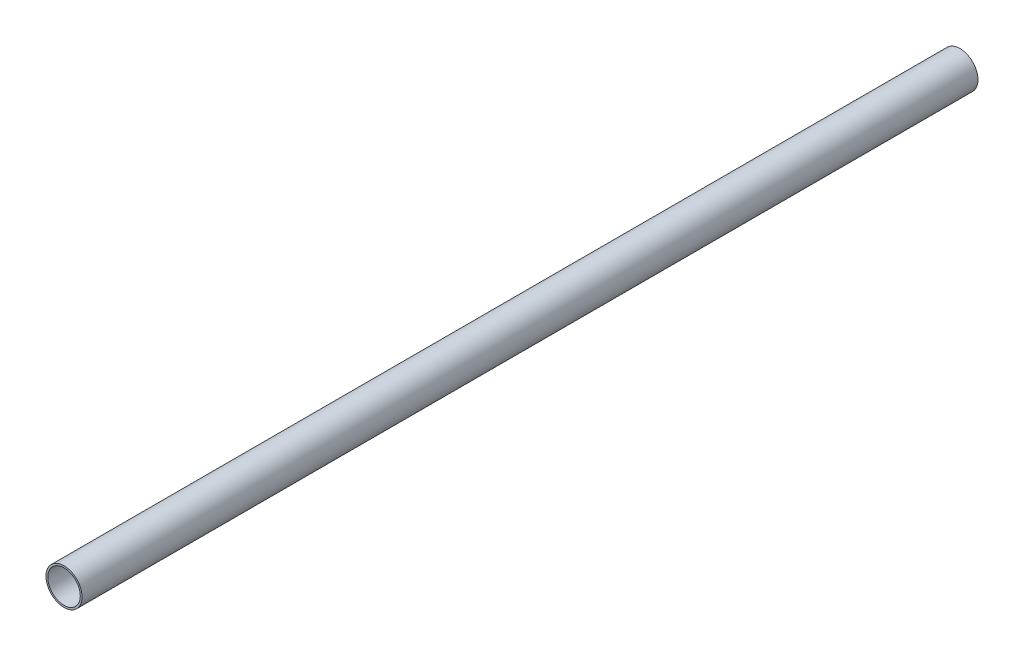
ISO-10303-21;
HEADER;
FILE_DESCRIPTION(('STEP AP214'),'2;1');
FILE_NAME('part.step','',(''),(''),'','','');
FILE_SCHEMA(('AUTOMOTIVE_DESIGN { 1 0 10303 214 1 1 1 1 }'));
ENDSEC;
DATA;
#1=APPLICATION_CONTEXT('core data for automotive mechanical design processes');
#2=APPLICATION_PROTOCOL_DEFINITION('international standard','automotive_design',2000,#1);
#3=PRODUCT_CONTEXT('',#1,'mechanical');
#4=PRODUCT('Part','Part','',(#3));
#5=PRODUCT_RELATED_PRODUCT_CATEGORY('part','',(#4));
#6=PRODUCT_DEFINITION_FORMATION('','',#4);
#7=PRODUCT_DEFINITION_CONTEXT('part definition',#1,'design');
#8=PRODUCT_DEFINITION('design','',#6,#7);
#9=PRODUCT_DEFINITION_SHAPE('','',#8);
#10=(LENGTH_UNIT() NAMED_UNIT(*) SI_UNIT(.MILLI.,.METRE.));
#11=(NAMED_UNIT(*) PLANE_ANGLE_UNIT() SI_UNIT($,.RADIAN.));
#12=(NAMED_UNIT(*) SI_UNIT($,.STERADIAN.) SOLID_ANGLE_UNIT());
#13=UNCERTAINTY_MEASURE_WITH_UNIT(LENGTH_MEASURE(1.E-05),#10,'distance_accuracy_value','');
#14=(GEOMETRIC_REPRESENTATION_CONTEXT(3) GLOBAL_UNCERTAINTY_ASSIGNED_CONTEXT((#13)) GLOBAL_UNIT_ASSIGNED_CONTEXT((#10,
#11,#12)) REPRESENTATION_CONTEXT('',''));
#15=CARTESIAN_POINT('',(0.,0.,0.));
#16=DIRECTION('',(0.,0.,1.));
#17=DIRECTION('',(1.,0.,0.));
#18=AXIS2_PLACEMENT_3D('',#15,#16,#17);
#19=CARTESIAN_POINT('',(0.,0.,496.));
#20=DIRECTION('',(0.,0.,1.));
#21=DIRECTION('',(1.,0.,0.));
#22=AXIS2_PLACEMENT_3D('',#19,#20,#21);
#23=PLANE('',#22);
#24=CARTESIAN_POINT('',(0.,0.,496.));
#25=DIRECTION('',(0.,0.,1.));
#26=DIRECTION('',(1.,0.,0.));
#27=AXIS2_PLACEMENT_3D('',#24,#25,#26);
#28=CIRCLE('',#27,10.);
#29=CARTESIAN_POINT('',(10.,0.,496.));
#30=VERTEX_POINT('',#29);
#31=EDGE_CURVE('E10',#30,#30,#28,.T.);
#32=ORIENTED_EDGE('',*,*,#31,.T.);
#33=EDGE_LOOP('',(#32));
#34=FACE_BOUND('',#33,.T.);
#35=CARTESIAN_POINT('',(0.,0.,496.));
#36=DIRECTION('',(0.,0.,1.));
#37=DIRECTION('',(1.,0.,0.));
#38=AXIS2_PLACEMENT_3D('',#35,#36,#37);
#39=CIRCLE('',#38,9.);
#40=CARTESIAN_POINT('',(9.,0.,496.));
#41=VERTEX_POINT('',#40);
#42=EDGE_CURVE('E56',#41,#41,#39,.T.);
#43=ORIENTED_EDGE('',*,*,#42,.F.);
#44=EDGE_LOOP('',(#43));
#45=FACE_BOUND('',#44,.T.);
#46=ADVANCED_FACE('F43',(#34,#45),#23,.T.);
#47=CARTESIAN_POINT('',(0.,0.,0.));
#48=DIRECTION('',(0.,0.,1.));
#49=DIRECTION('',(1.,0.,0.));
#50=AXIS2_PLACEMENT_3D('',#47,#48,#49);
#51=PLANE('',#50);
#52=CARTESIAN_POINT('',(0.,0.,0.));
#53=DIRECTION('',(0.,0.,1.));
#54=DIRECTION('',(1.,0.,0.));
#55=AXIS2_PLACEMENT_3D('',#52,#53,#54);
#56=CIRCLE('',#55,10.);
#57=CARTESIAN_POINT('',(10.,0.,0.));
#58=VERTEX_POINT('',#57);
#59=EDGE_CURVE('E47',#58,#58,#56,.T.);
#60=ORIENTED_EDGE('',*,*,#59,.F.);
#61=EDGE_LOOP('',(#60));
#62=FACE_BOUND('',#61,.T.);
#63=CARTESIAN_POINT('',(0.,0.,0.));
#64=DIRECTION('',(0.,0.,1.));
#65=DIRECTION('',(1.,0.,0.));
#66=AXIS2_PLACEMENT_3D('',#63,#64,#65);
#67=CIRCLE('',#66,9.);
#68=CARTESIAN_POINT('',(9.,0.,0.));
#69=VERTEX_POINT('',#68);
#70=EDGE_CURVE('E58',#69,#69,#67,.T.);
#71=ORIENTED_EDGE('',*,*,#70,.T.);
#72=EDGE_LOOP('',(#71));
#73=FACE_BOUND('',#72,.T.);
#74=ADVANCED_FACE('F70',(#62,#73),#51,.F.);
#75=CARTESIAN_POINT('',(0.,0.,496.));
#76=DIRECTION('',(0.,0.,-1.));
#77=DIRECTION('',(-1.,0.,0.));
#78=AXIS2_PLACEMENT_3D('',#75,#76,#77);
#79=CYLINDRICAL_SURFACE('',#78,10.);
#80=ORIENTED_EDGE('',*,*,#31,.F.);
#81=EDGE_LOOP('',(#80));
#82=FACE_BOUND('',#81,.T.);
#83=ORIENTED_EDGE('',*,*,#59,.T.);
#84=EDGE_LOOP('',(#83));
#85=FACE_BOUND('',#84,.T.);
#86=ADVANCED_FACE('F45',(#82,#85),#79,.T.);
#87=CARTESIAN_POINT('',(0.,0.,496.));
#88=DIRECTION('',(0.,0.,-1.));
#89=DIRECTION('',(-1.,0.,0.));
#90=AXIS2_PLACEMENT_3D('',#87,#88,#89);
#91=CYLINDRICAL_SURFACE('',#90,9.);
#92=ORIENTED_EDGE('',*,*,#42,.T.);
#93=EDGE_LOOP('',(#92));
#94=FACE_BOUND('',#93,.T.);
#95=ORIENTED_EDGE('',*,*,#70,.F.);
#96=EDGE_LOOP('',(#95));
#97=FACE_BOUND('',#96,.T.);
#98=ADVANCED_FACE('F66',(#94,#97),#91,.F.);
#99=CLOSED_SHELL('',(#46,#74,#86,#98));
#100=MANIFOLD_SOLID_BREP('B2',#99);
#101=ADVANCED_BREP_SHAPE_REPRESENTATION('',(#18,#100),#14);
#102=SHAPE_DEFINITION_REPRESENTATION(#9,#101);
ENDSEC;
END-ISO-10303-21;
